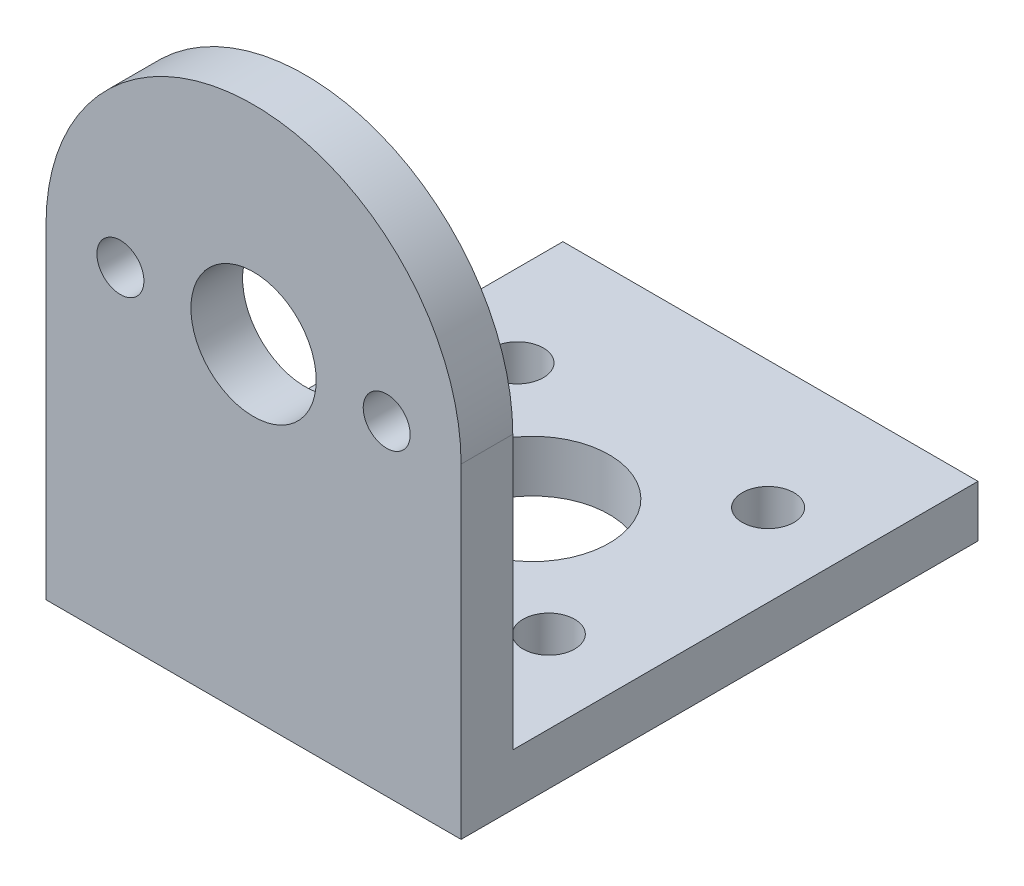
ISO-10303-21;
HEADER;
FILE_DESCRIPTION(('STEP AP214'),'2;1');
FILE_NAME('part.step','',(''),(''),'','','');
FILE_SCHEMA(('AUTOMOTIVE_DESIGN { 1 0 10303 214 1 1 1 1 }'));
ENDSEC;
DATA;
#1=APPLICATION_CONTEXT('core data for automotive mechanical design processes');
#2=APPLICATION_PROTOCOL_DEFINITION('international standard','automotive_design',2000,#1);
#3=PRODUCT_CONTEXT('',#1,'mechanical');
#4=PRODUCT('Part','Part','',(#3));
#5=PRODUCT_RELATED_PRODUCT_CATEGORY('part','',(#4));
#6=PRODUCT_DEFINITION_FORMATION('','',#4);
#7=PRODUCT_DEFINITION_CONTEXT('part definition',#1,'design');
#8=PRODUCT_DEFINITION('design','',#6,#7);
#9=PRODUCT_DEFINITION_SHAPE('','',#8);
#10=(LENGTH_UNIT() NAMED_UNIT(*) SI_UNIT(.MILLI.,.METRE.));
#11=(NAMED_UNIT(*) PLANE_ANGLE_UNIT() SI_UNIT($,.RADIAN.));
#12=(NAMED_UNIT(*) SI_UNIT($,.STERADIAN.) SOLID_ANGLE_UNIT());
#13=UNCERTAINTY_MEASURE_WITH_UNIT(LENGTH_MEASURE(1.E-05),#10,'distance_accuracy_value','');
#14=(GEOMETRIC_REPRESENTATION_CONTEXT(3) GLOBAL_UNCERTAINTY_ASSIGNED_CONTEXT((#13)) GLOBAL_UNIT_ASSIGNED_CONTEXT((#10,
#11,#12)) REPRESENTATION_CONTEXT('',''));
#15=CARTESIAN_POINT('',(0.,0.,0.));
#16=DIRECTION('',(0.,0.,1.));
#17=DIRECTION('',(1.,0.,0.));
#18=AXIS2_PLACEMENT_3D('',#15,#16,#17);
#19=CARTESIAN_POINT('',(0.,0.,0.));
#20=DIRECTION('',(0.,0.,-1.));
#21=DIRECTION('',(-1.,0.,0.));
#22=AXIS2_PLACEMENT_3D('',#19,#20,#21);
#23=PLANE('',#22);
#24=CARTESIAN_POINT('',(-8.5,0.,0.));
#25=DIRECTION('',(0.,0.,1.));
#26=DIRECTION('',(1.,0.,0.));
#27=AXIS2_PLACEMENT_3D('',#24,#25,#26);
#28=CIRCLE('',#27,1.5);
#29=CARTESIAN_POINT('',(-7.,0.,0.));
#30=VERTEX_POINT('',#29);
#31=EDGE_CURVE('E127',#30,#30,#28,.T.);
#32=ORIENTED_EDGE('',*,*,#31,.T.);
#33=EDGE_LOOP('',(#32));
#34=FACE_BOUND('',#33,.T.);
#35=CARTESIAN_POINT('',(0.,0.,0.));
#36=DIRECTION('',(0.,0.,1.));
#37=DIRECTION('',(1.,0.,0.));
#38=AXIS2_PLACEMENT_3D('',#35,#36,#37);
#39=CIRCLE('',#38,4.);
#40=CARTESIAN_POINT('',(4.,0.,0.));
#41=VERTEX_POINT('',#40);
#42=EDGE_CURVE('E133',#41,#41,#39,.T.);
#43=ORIENTED_EDGE('',*,*,#42,.T.);
#44=EDGE_LOOP('',(#43));
#45=FACE_BOUND('',#44,.T.);
#46=CARTESIAN_POINT('',(8.5,0.,0.));
#47=DIRECTION('',(0.,0.,1.));
#48=DIRECTION('',(-1.,0.,0.));
#49=AXIS2_PLACEMENT_3D('',#46,#47,#48);
#50=CIRCLE('',#49,1.5);
#51=CARTESIAN_POINT('',(7.,0.,0.));
#52=VERTEX_POINT('',#51);
#53=EDGE_CURVE('E122',#52,#52,#50,.T.);
#54=ORIENTED_EDGE('',*,*,#53,.T.);
#55=EDGE_LOOP('',(#54));
#56=FACE_BOUND('',#55,.T.);
#57=DIRECTION('',(0.,1.,0.));
#58=VECTOR('',#57,1.);
#59=CARTESIAN_POINT('',(13.25,0.,0.));
#60=LINE('',#59,#58);
#61=CARTESIAN_POINT('',(13.25,-17.45,0.));
#62=VERTEX_POINT('',#61);
#63=CARTESIAN_POINT('',(13.25,0.,0.));
#64=VERTEX_POINT('',#63);
#65=EDGE_CURVE('E73',#62,#64,#60,.T.);
#66=ORIENTED_EDGE('',*,*,#65,.F.);
#67=DIRECTION('',(-1.,0.,0.));
#68=VECTOR('',#67,1.);
#69=CARTESIAN_POINT('',(13.25,-17.45,0.));
#70=LINE('',#69,#68);
#71=CARTESIAN_POINT('',(-13.25,-17.45,0.));
#72=VERTEX_POINT('',#71);
#73=EDGE_CURVE('E97',#62,#72,#70,.T.);
#74=ORIENTED_EDGE('',*,*,#73,.T.);
#75=DIRECTION('',(0.,-1.,0.));
#76=VECTOR('',#75,1.);
#77=CARTESIAN_POINT('',(-13.25,0.,0.));
#78=LINE('',#77,#76);
#79=CARTESIAN_POINT('',(-13.25,0.,0.));
#80=VERTEX_POINT('',#79);
#81=EDGE_CURVE('E151',#80,#72,#78,.T.);
#82=ORIENTED_EDGE('',*,*,#81,.F.);
#83=CARTESIAN_POINT('',(0.,0.,0.));
#84=DIRECTION('',(0.,0.,1.));
#85=DIRECTION('',(-1.,0.,0.));
#86=AXIS2_PLACEMENT_3D('',#83,#84,#85);
#87=CIRCLE('',#86,13.25);
#88=EDGE_CURVE('E139',#64,#80,#87,.T.);
#89=ORIENTED_EDGE('',*,*,#88,.F.);
#90=EDGE_LOOP('',(#66,#74,#82,#89));
#91=FACE_BOUND('',#90,.T.);
#92=ADVANCED_FACE('F34',(#34,#45,#56,#91),#23,.T.);
#93=CARTESIAN_POINT('',(0.,0.,3.3));
#94=DIRECTION('',(0.,0.,-1.));
#95=DIRECTION('',(-1.,0.,0.));
#96=AXIS2_PLACEMENT_3D('',#93,#94,#95);
#97=PLANE('',#96);
#98=CARTESIAN_POINT('',(0.,0.,3.3));
#99=DIRECTION('',(0.,0.,1.));
#100=DIRECTION('',(-1.,0.,0.));
#101=AXIS2_PLACEMENT_3D('',#98,#99,#100);
#102=CIRCLE('',#101,13.25);
#103=CARTESIAN_POINT('',(13.25,0.,3.3));
#104=VERTEX_POINT('',#103);
#105=CARTESIAN_POINT('',(-13.25,0.,3.3));
#106=VERTEX_POINT('',#105);
#107=EDGE_CURVE('E142',#104,#106,#102,.T.);
#108=ORIENTED_EDGE('',*,*,#107,.T.);
#109=DIRECTION('',(0.,-1.,0.));
#110=VECTOR('',#109,1.);
#111=CARTESIAN_POINT('',(-13.25,0.,3.3));
#112=LINE('',#111,#110);
#113=CARTESIAN_POINT('',(-13.25,-20.75,3.3));
#114=VERTEX_POINT('',#113);
#115=EDGE_CURVE('E80',#106,#114,#112,.T.);
#116=ORIENTED_EDGE('',*,*,#115,.T.);
#117=DIRECTION('',(1.,0.,0.));
#118=VECTOR('',#117,1.);
#119=CARTESIAN_POINT('',(-13.25,-20.75,3.3));
#120=LINE('',#119,#118);
#121=CARTESIAN_POINT('',(13.25,-20.75,3.3));
#122=VERTEX_POINT('',#121);
#123=EDGE_CURVE('E145',#114,#122,#120,.T.);
#124=ORIENTED_EDGE('',*,*,#123,.T.);
#125=DIRECTION('',(0.,1.,0.));
#126=VECTOR('',#125,1.);
#127=CARTESIAN_POINT('',(13.25,0.,3.3));
#128=LINE('',#127,#126);
#129=EDGE_CURVE('E58',#122,#104,#128,.T.);
#130=ORIENTED_EDGE('',*,*,#129,.T.);
#131=EDGE_LOOP('',(#108,#116,#124,#130));
#132=FACE_BOUND('',#131,.T.);
#133=CARTESIAN_POINT('',(0.,0.,3.3));
#134=DIRECTION('',(0.,0.,1.));
#135=DIRECTION('',(1.,0.,0.));
#136=AXIS2_PLACEMENT_3D('',#133,#134,#135);
#137=CIRCLE('',#136,4.);
#138=CARTESIAN_POINT('',(4.,0.,3.3));
#139=VERTEX_POINT('',#138);
#140=EDGE_CURVE('E136',#139,#139,#137,.T.);
#141=ORIENTED_EDGE('',*,*,#140,.F.);
#142=EDGE_LOOP('',(#141));
#143=FACE_BOUND('',#142,.T.);
#144=CARTESIAN_POINT('',(-8.5,0.,3.3));
#145=DIRECTION('',(0.,0.,1.));
#146=DIRECTION('',(1.,0.,0.));
#147=AXIS2_PLACEMENT_3D('',#144,#145,#146);
#148=CIRCLE('',#147,1.5);
#149=CARTESIAN_POINT('',(-7.,0.,3.3));
#150=VERTEX_POINT('',#149);
#151=EDGE_CURVE('E130',#150,#150,#148,.T.);
#152=ORIENTED_EDGE('',*,*,#151,.F.);
#153=EDGE_LOOP('',(#152));
#154=FACE_BOUND('',#153,.T.);
#155=CARTESIAN_POINT('',(8.5,0.,3.3));
#156=DIRECTION('',(0.,0.,1.));
#157=DIRECTION('',(-1.,0.,0.));
#158=AXIS2_PLACEMENT_3D('',#155,#156,#157);
#159=CIRCLE('',#158,1.5);
#160=CARTESIAN_POINT('',(7.,0.,3.3));
#161=VERTEX_POINT('',#160);
#162=EDGE_CURVE('E124',#161,#161,#159,.T.);
#163=ORIENTED_EDGE('',*,*,#162,.F.);
#164=EDGE_LOOP('',(#163));
#165=FACE_BOUND('',#164,.T.);
#166=ADVANCED_FACE('F165',(#132,#143,#154,#165),#97,.F.);
#167=CARTESIAN_POINT('',(0.,0.,3.3));
#168=DIRECTION('',(0.,0.,-1.));
#169=DIRECTION('',(-1.,0.,0.));
#170=AXIS2_PLACEMENT_3D('',#167,#168,#169);
#171=CYLINDRICAL_SURFACE('',#170,13.25);
#172=ORIENTED_EDGE('',*,*,#88,.T.);
#173=DIRECTION('',(0.,0.,-1.));
#174=VECTOR('',#173,1.);
#175=CARTESIAN_POINT('',(-13.25,0.,3.3));
#176=LINE('',#175,#174);
#177=EDGE_CURVE('E11',#106,#80,#176,.T.);
#178=ORIENTED_EDGE('',*,*,#177,.F.);
#179=ORIENTED_EDGE('',*,*,#107,.F.);
#180=DIRECTION('',(0.,0.,-1.));
#181=VECTOR('',#180,1.);
#182=CARTESIAN_POINT('',(13.25,0.,3.3));
#183=LINE('',#182,#181);
#184=EDGE_CURVE('E148',#104,#64,#183,.T.);
#185=ORIENTED_EDGE('',*,*,#184,.T.);
#186=EDGE_LOOP('',(#172,#178,#179,#185));
#187=FACE_BOUND('',#186,.T.);
#188=ADVANCED_FACE('F36',(#187),#171,.T.);
#189=CARTESIAN_POINT('',(-13.25,0.,3.3));
#190=DIRECTION('',(1.,0.,0.));
#191=DIRECTION('',(0.,1.,0.));
#192=AXIS2_PLACEMENT_3D('',#189,#190,#191);
#193=PLANE('',#192);
#194=ORIENTED_EDGE('',*,*,#81,.T.);
#195=DIRECTION('',(0.,0.,1.));
#196=VECTOR('',#195,1.);
#197=CARTESIAN_POINT('',(-13.25,-17.45,-29.7));
#198=LINE('',#197,#196);
#199=CARTESIAN_POINT('',(-13.25,-17.45,-29.7));
#200=VERTEX_POINT('',#199);
#201=EDGE_CURVE('E49',#200,#72,#198,.T.);
#202=ORIENTED_EDGE('',*,*,#201,.F.);
#203=DIRECTION('',(0.,-1.,0.));
#204=VECTOR('',#203,1.);
#205=CARTESIAN_POINT('',(-13.25,-20.75,-29.7));
#206=LINE('',#205,#204);
#207=CARTESIAN_POINT('',(-13.25,-20.75,-29.7));
#208=VERTEX_POINT('',#207);
#209=EDGE_CURVE('E109',#200,#208,#206,.T.);
#210=ORIENTED_EDGE('',*,*,#209,.T.);
#211=DIRECTION('',(0.,0.,-1.));
#212=VECTOR('',#211,1.);
#213=CARTESIAN_POINT('',(-13.25,-20.75,3.3));
#214=LINE('',#213,#212);
#215=EDGE_CURVE('E42',#114,#208,#214,.T.);
#216=ORIENTED_EDGE('',*,*,#215,.F.);
#217=ORIENTED_EDGE('',*,*,#115,.F.);
#218=ORIENTED_EDGE('',*,*,#177,.T.);
#219=EDGE_LOOP('',(#194,#202,#210,#216,#217,#218));
#220=FACE_BOUND('',#219,.T.);
#221=ADVANCED_FACE('F159',(#220),#193,.F.);
#222=CARTESIAN_POINT('',(-13.25,-20.75,3.3));
#223=DIRECTION('',(0.,1.,0.));
#224=DIRECTION('',(0.,0.,1.));
#225=AXIS2_PLACEMENT_3D('',#222,#223,#224);
#226=PLANE('',#225);
#227=CARTESIAN_POINT('',(8.,-20.75,-21.55));
#228=DIRECTION('',(0.,1.,0.));
#229=DIRECTION('',(0.,0.,1.));
#230=AXIS2_PLACEMENT_3D('',#227,#228,#229);
#231=CIRCLE('',#230,1.65);
#232=CARTESIAN_POINT('',(8.,-20.75,-19.9));
#233=VERTEX_POINT('',#232);
#234=EDGE_CURVE('E330',#233,#233,#231,.F.);
#235=ORIENTED_EDGE('',*,*,#234,.F.);
#236=EDGE_LOOP('',(#235));
#237=FACE_BOUND('',#236,.T.);
#238=CARTESIAN_POINT('',(8.,-20.75,-7.55));
#239=DIRECTION('',(0.,1.,0.));
#240=DIRECTION('',(0.,0.,1.));
#241=AXIS2_PLACEMENT_3D('',#238,#239,#240);
#242=CIRCLE('',#241,1.65);
#243=CARTESIAN_POINT('',(8.,-20.75,-5.9));
#244=VERTEX_POINT('',#243);
#245=EDGE_CURVE('E338',#244,#244,#242,.F.);
#246=ORIENTED_EDGE('',*,*,#245,.F.);
#247=EDGE_LOOP('',(#246));
#248=FACE_BOUND('',#247,.T.);
#249=CARTESIAN_POINT('',(-7.99999999999999,-20.75,-7.55));
#250=DIRECTION('',(0.,1.,0.));
#251=DIRECTION('',(0.,0.,1.));
#252=AXIS2_PLACEMENT_3D('',#249,#250,#251);
#253=CIRCLE('',#252,1.65);
#254=CARTESIAN_POINT('',(-7.99999999999999,-20.75,-5.9));
#255=VERTEX_POINT('',#254);
#256=EDGE_CURVE('E351',#255,#255,#253,.F.);
#257=ORIENTED_EDGE('',*,*,#256,.F.);
#258=EDGE_LOOP('',(#257));
#259=FACE_BOUND('',#258,.T.);
#260=CARTESIAN_POINT('',(-8.,-20.75,-21.55));
#261=DIRECTION('',(0.,1.,0.));
#262=DIRECTION('',(0.,0.,1.));
#263=AXIS2_PLACEMENT_3D('',#260,#261,#262);
#264=CIRCLE('',#263,1.65);
#265=CARTESIAN_POINT('',(-8.,-20.75,-19.9));
#266=VERTEX_POINT('',#265);
#267=EDGE_CURVE('E342',#266,#266,#264,.F.);
#268=ORIENTED_EDGE('',*,*,#267,.F.);
#269=EDGE_LOOP('',(#268));
#270=FACE_BOUND('',#269,.T.);
#271=CARTESIAN_POINT('',(0.,-20.75,-14.5));
#272=DIRECTION('',(0.,1.,0.));
#273=DIRECTION('',(0.,0.,1.));
#274=AXIS2_PLACEMENT_3D('',#271,#272,#273);
#275=CIRCLE('',#274,4.9);
#276=CARTESIAN_POINT('',(0.,-20.75,-9.6));
#277=VERTEX_POINT('',#276);
#278=EDGE_CURVE('E115',#277,#277,#275,.F.);
#279=ORIENTED_EDGE('',*,*,#278,.F.);
#280=EDGE_LOOP('',(#279));
#281=FACE_BOUND('',#280,.T.);
#282=ORIENTED_EDGE('',*,*,#215,.T.);
#283=DIRECTION('',(1.,0.,0.));
#284=VECTOR('',#283,1.);
#285=CARTESIAN_POINT('',(13.25,-20.75,-29.7));
#286=LINE('',#285,#284);
#287=CARTESIAN_POINT('',(13.25,-20.75,-29.7));
#288=VERTEX_POINT('',#287);
#289=EDGE_CURVE('E99',#208,#288,#286,.T.);
#290=ORIENTED_EDGE('',*,*,#289,.T.);
#291=DIRECTION('',(0.,0.,-1.));
#292=VECTOR('',#291,1.);
#293=CARTESIAN_POINT('',(13.25,-20.75,3.3));
#294=LINE('',#293,#292);
#295=EDGE_CURVE('E113',#122,#288,#294,.T.);
#296=ORIENTED_EDGE('',*,*,#295,.F.);
#297=ORIENTED_EDGE('',*,*,#123,.F.);
#298=EDGE_LOOP('',(#282,#290,#296,#297));
#299=FACE_BOUND('',#298,.T.);
#300=ADVANCED_FACE('F158',(#237,#248,#259,#270,#281,#299),#226,.F.);
#301=CARTESIAN_POINT('',(13.25,0.,3.3));
#302=DIRECTION('',(-1.,0.,0.));
#303=DIRECTION('',(0.,-1.,0.));
#304=AXIS2_PLACEMENT_3D('',#301,#302,#303);
#305=PLANE('',#304);
#306=ORIENTED_EDGE('',*,*,#295,.T.);
#307=DIRECTION('',(0.,1.,0.));
#308=VECTOR('',#307,1.);
#309=CARTESIAN_POINT('',(13.25,-20.75,-29.7));
#310=LINE('',#309,#308);
#311=CARTESIAN_POINT('',(13.25,-17.45,-29.7));
#312=VERTEX_POINT('',#311);
#313=EDGE_CURVE('E106',#288,#312,#310,.T.);
#314=ORIENTED_EDGE('',*,*,#313,.T.);
#315=DIRECTION('',(0.,0.,1.));
#316=VECTOR('',#315,1.);
#317=CARTESIAN_POINT('',(13.25,-17.45,-29.7));
#318=LINE('',#317,#316);
#319=EDGE_CURVE('E93',#312,#62,#318,.T.);
#320=ORIENTED_EDGE('',*,*,#319,.T.);
#321=ORIENTED_EDGE('',*,*,#65,.T.);
#322=ORIENTED_EDGE('',*,*,#184,.F.);
#323=ORIENTED_EDGE('',*,*,#129,.F.);
#324=EDGE_LOOP('',(#306,#314,#320,#321,#322,#323));
#325=FACE_BOUND('',#324,.T.);
#326=ADVANCED_FACE('F111',(#325),#305,.F.);
#327=CARTESIAN_POINT('',(0.,0.,3.3));
#328=DIRECTION('',(0.,0.,-1.));
#329=DIRECTION('',(-1.,0.,0.));
#330=AXIS2_PLACEMENT_3D('',#327,#328,#329);
#331=CYLINDRICAL_SURFACE('',#330,4.);
#332=ORIENTED_EDGE('',*,*,#140,.T.);
#333=EDGE_LOOP('',(#332));
#334=FACE_BOUND('',#333,.T.);
#335=ORIENTED_EDGE('',*,*,#42,.F.);
#336=EDGE_LOOP('',(#335));
#337=FACE_BOUND('',#336,.T.);
#338=ADVANCED_FACE('F192',(#334,#337),#331,.F.);
#339=CARTESIAN_POINT('',(-8.5,0.,3.3));
#340=DIRECTION('',(0.,0.,-1.));
#341=DIRECTION('',(-1.,0.,0.));
#342=AXIS2_PLACEMENT_3D('',#339,#340,#341);
#343=CYLINDRICAL_SURFACE('',#342,1.5);
#344=ORIENTED_EDGE('',*,*,#151,.T.);
#345=EDGE_LOOP('',(#344));
#346=FACE_BOUND('',#345,.T.);
#347=ORIENTED_EDGE('',*,*,#31,.F.);
#348=EDGE_LOOP('',(#347));
#349=FACE_BOUND('',#348,.T.);
#350=ADVANCED_FACE('F178',(#346,#349),#343,.F.);
#351=CARTESIAN_POINT('',(8.5,0.,3.3));
#352=DIRECTION('',(0.,0.,-1.));
#353=DIRECTION('',(-1.,0.,0.));
#354=AXIS2_PLACEMENT_3D('',#351,#352,#353);
#355=CYLINDRICAL_SURFACE('',#354,1.5);
#356=ORIENTED_EDGE('',*,*,#162,.T.);
#357=EDGE_LOOP('',(#356));
#358=FACE_BOUND('',#357,.T.);
#359=ORIENTED_EDGE('',*,*,#53,.F.);
#360=EDGE_LOOP('',(#359));
#361=FACE_BOUND('',#360,.T.);
#362=ADVANCED_FACE('F175',(#358,#361),#355,.F.);
#363=CARTESIAN_POINT('',(13.25,-17.45,-29.7));
#364=DIRECTION('',(0.,1.,0.));
#365=DIRECTION('',(-1.,0.,0.));
#366=AXIS2_PLACEMENT_3D('',#363,#364,#365);
#367=PLANE('',#366);
#368=CARTESIAN_POINT('',(8.,-17.45,-21.55));
#369=DIRECTION('',(0.,1.,0.));
#370=DIRECTION('',(1.,0.,0.));
#371=AXIS2_PLACEMENT_3D('',#368,#369,#370);
#372=CIRCLE('',#371,1.65);
#373=CARTESIAN_POINT('',(9.65,-17.45,-21.55));
#374=VERTEX_POINT('',#373);
#375=EDGE_CURVE('E333',#374,#374,#372,.T.);
#376=ORIENTED_EDGE('',*,*,#375,.F.);
#377=EDGE_LOOP('',(#376));
#378=FACE_BOUND('',#377,.T.);
#379=CARTESIAN_POINT('',(8.,-17.45,-7.55));
#380=DIRECTION('',(0.,1.,0.));
#381=DIRECTION('',(1.,0.,0.));
#382=AXIS2_PLACEMENT_3D('',#379,#380,#381);
#383=CIRCLE('',#382,1.65);
#384=CARTESIAN_POINT('',(9.65,-17.45,-7.55));
#385=VERTEX_POINT('',#384);
#386=EDGE_CURVE('E335',#385,#385,#383,.T.);
#387=ORIENTED_EDGE('',*,*,#386,.F.);
#388=EDGE_LOOP('',(#387));
#389=FACE_BOUND('',#388,.T.);
#390=CARTESIAN_POINT('',(-7.99999999999999,-17.45,-7.55));
#391=DIRECTION('',(0.,1.,0.));
#392=DIRECTION('',(-1.,0.,0.));
#393=AXIS2_PLACEMENT_3D('',#390,#391,#392);
#394=CIRCLE('',#393,1.65);
#395=CARTESIAN_POINT('',(-9.65,-17.45,-7.55));
#396=VERTEX_POINT('',#395);
#397=EDGE_CURVE('E354',#396,#396,#394,.T.);
#398=ORIENTED_EDGE('',*,*,#397,.F.);
#399=EDGE_LOOP('',(#398));
#400=FACE_BOUND('',#399,.T.);
#401=CARTESIAN_POINT('',(-8.,-17.45,-21.55));
#402=DIRECTION('',(0.,1.,0.));
#403=DIRECTION('',(-1.,0.,0.));
#404=AXIS2_PLACEMENT_3D('',#401,#402,#403);
#405=CIRCLE('',#404,1.65);
#406=CARTESIAN_POINT('',(-9.65,-17.45,-21.55));
#407=VERTEX_POINT('',#406);
#408=EDGE_CURVE('E347',#407,#407,#405,.T.);
#409=ORIENTED_EDGE('',*,*,#408,.F.);
#410=EDGE_LOOP('',(#409));
#411=FACE_BOUND('',#410,.T.);
#412=CARTESIAN_POINT('',(0.,-17.45,-14.5));
#413=DIRECTION('',(0.,1.,0.));
#414=DIRECTION('',(-1.,0.,0.));
#415=AXIS2_PLACEMENT_3D('',#412,#413,#414);
#416=CIRCLE('',#415,4.9);
#417=CARTESIAN_POINT('',(-4.9,-17.45,-14.5));
#418=VERTEX_POINT('',#417);
#419=EDGE_CURVE('E340',#418,#418,#416,.T.);
#420=ORIENTED_EDGE('',*,*,#419,.F.);
#421=EDGE_LOOP('',(#420));
#422=FACE_BOUND('',#421,.T.);
#423=ORIENTED_EDGE('',*,*,#73,.F.);
#424=ORIENTED_EDGE('',*,*,#319,.F.);
#425=DIRECTION('',(-1.,0.,0.));
#426=VECTOR('',#425,1.);
#427=CARTESIAN_POINT('',(13.25,-17.45,-29.7));
#428=LINE('',#427,#426);
#429=EDGE_CURVE('E96',#312,#200,#428,.T.);
#430=ORIENTED_EDGE('',*,*,#429,.T.);
#431=ORIENTED_EDGE('',*,*,#201,.T.);
#432=EDGE_LOOP('',(#423,#424,#430,#431));
#433=FACE_BOUND('',#432,.T.);
#434=ADVANCED_FACE('F95',(#378,#389,#400,#411,#422,#433),#367,.T.);
#435=CARTESIAN_POINT('',(0.,0.,-29.7));
#436=DIRECTION('',(0.,0.,1.));
#437=DIRECTION('',(1.,0.,0.));
#438=AXIS2_PLACEMENT_3D('',#435,#436,#437);
#439=PLANE('',#438);
#440=ORIENTED_EDGE('',*,*,#313,.F.);
#441=ORIENTED_EDGE('',*,*,#289,.F.);
#442=ORIENTED_EDGE('',*,*,#209,.F.);
#443=ORIENTED_EDGE('',*,*,#429,.F.);
#444=EDGE_LOOP('',(#440,#441,#442,#443));
#445=FACE_BOUND('',#444,.T.);
#446=ADVANCED_FACE('F104',(#445),#439,.F.);
#447=CARTESIAN_POINT('',(0.,-34.6092929112563,-14.5));
#448=DIRECTION('',(0.,1.,0.));
#449=DIRECTION('',(-1.,0.,0.));
#450=AXIS2_PLACEMENT_3D('',#447,#448,#449);
#451=CYLINDRICAL_SURFACE('',#450,4.9);
#452=ORIENTED_EDGE('',*,*,#278,.T.);
#453=EDGE_LOOP('',(#452));
#454=FACE_BOUND('',#453,.T.);
#455=ORIENTED_EDGE('',*,*,#419,.T.);
#456=EDGE_LOOP('',(#455));
#457=FACE_BOUND('',#456,.T.);
#458=ADVANCED_FACE('F263',(#454,#457),#451,.F.);
#459=CARTESIAN_POINT('',(-7.99999999999999,-34.6092929112563,-21.55));
#460=DIRECTION('',(0.,1.,0.));
#461=DIRECTION('',(-1.,0.,0.));
#462=AXIS2_PLACEMENT_3D('',#459,#460,#461);
#463=CYLINDRICAL_SURFACE('',#462,1.65);
#464=ORIENTED_EDGE('',*,*,#267,.T.);
#465=EDGE_LOOP('',(#464));
#466=FACE_BOUND('',#465,.T.);
#467=ORIENTED_EDGE('',*,*,#408,.T.);
#468=EDGE_LOOP('',(#467));
#469=FACE_BOUND('',#468,.T.);
#470=ADVANCED_FACE('F283',(#466,#469),#463,.F.);
#471=CARTESIAN_POINT('',(-7.99999999999999,-34.6092929112563,-7.55));
#472=DIRECTION('',(0.,1.,0.));
#473=DIRECTION('',(-1.,0.,0.));
#474=AXIS2_PLACEMENT_3D('',#471,#472,#473);
#475=CYLINDRICAL_SURFACE('',#474,1.65);
#476=ORIENTED_EDGE('',*,*,#256,.T.);
#477=EDGE_LOOP('',(#476));
#478=FACE_BOUND('',#477,.T.);
#479=ORIENTED_EDGE('',*,*,#397,.T.);
#480=EDGE_LOOP('',(#479));
#481=FACE_BOUND('',#480,.T.);
#482=ADVANCED_FACE('F293',(#478,#481),#475,.F.);
#483=CARTESIAN_POINT('',(8.,-34.6092929112563,-7.55));
#484=DIRECTION('',(0.,1.,0.));
#485=DIRECTION('',(-1.,0.,0.));
#486=AXIS2_PLACEMENT_3D('',#483,#484,#485);
#487=CYLINDRICAL_SURFACE('',#486,1.65);
#488=ORIENTED_EDGE('',*,*,#245,.T.);
#489=EDGE_LOOP('',(#488));
#490=FACE_BOUND('',#489,.T.);
#491=ORIENTED_EDGE('',*,*,#386,.T.);
#492=EDGE_LOOP('',(#491));
#493=FACE_BOUND('',#492,.T.);
#494=ADVANCED_FACE('F303',(#490,#493),#487,.F.);
#495=CARTESIAN_POINT('',(8.,-34.6092929112563,-21.55));
#496=DIRECTION('',(0.,1.,0.));
#497=DIRECTION('',(-1.,0.,0.));
#498=AXIS2_PLACEMENT_3D('',#495,#496,#497);
#499=CYLINDRICAL_SURFACE('',#498,1.65);
#500=ORIENTED_EDGE('',*,*,#234,.T.);
#501=EDGE_LOOP('',(#500));
#502=FACE_BOUND('',#501,.T.);
#503=ORIENTED_EDGE('',*,*,#375,.T.);
#504=EDGE_LOOP('',(#503));
#505=FACE_BOUND('',#504,.T.);
#506=ADVANCED_FACE('F313',(#502,#505),#499,.F.);
#507=CLOSED_SHELL('',(#92,#166,#188,#221,#300,#326,#338,#350,#362,#434,#446,#458,#470,#482,#494,#506));
#508=MANIFOLD_SOLID_BREP('B2',#507);
#509=ADVANCED_BREP_SHAPE_REPRESENTATION('',(#18,#508),#14);
#510=SHAPE_DEFINITION_REPRESENTATION(#9,#509);
ENDSEC;
END-ISO-10303-21;
